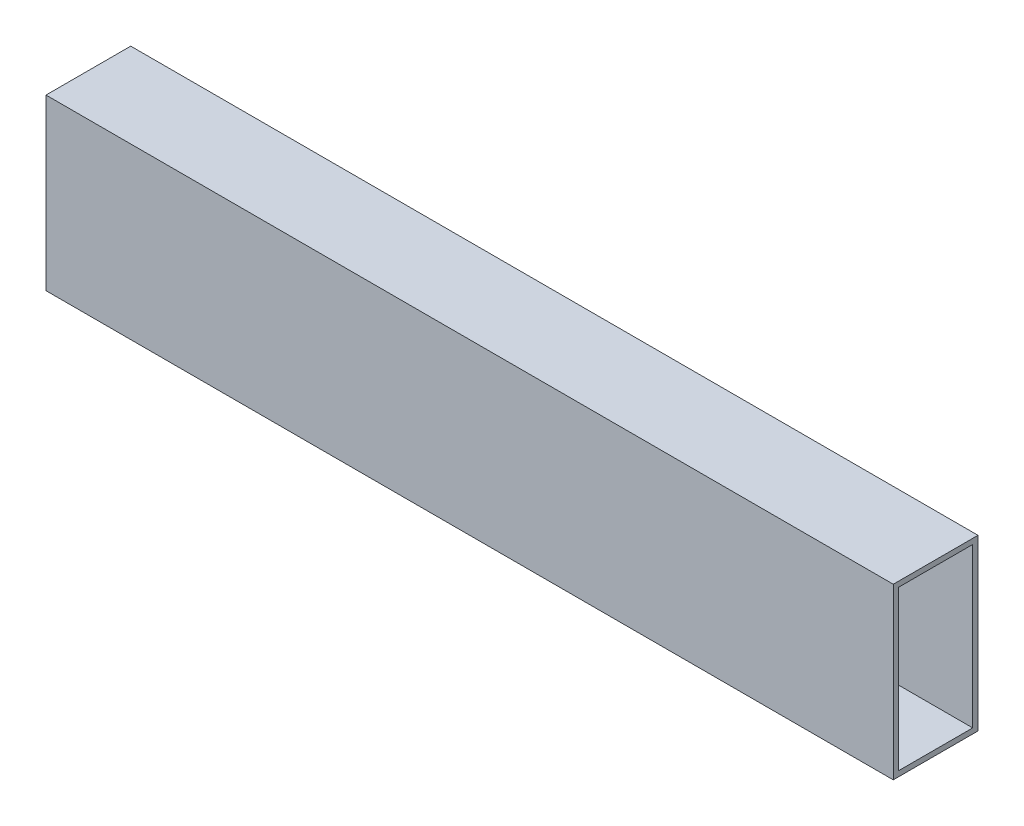
ISO-10303-21;
HEADER;
FILE_DESCRIPTION(('STEP AP214'),'2;1');
FILE_NAME('part.step','',(''),(''),'','','');
FILE_SCHEMA(('AUTOMOTIVE_DESIGN { 1 0 10303 214 1 1 1 1 }'));
ENDSEC;
DATA;
#1=APPLICATION_CONTEXT('core data for automotive mechanical design processes');
#2=APPLICATION_PROTOCOL_DEFINITION('international standard','automotive_design',2000,#1);
#3=PRODUCT_CONTEXT('',#1,'mechanical');
#4=PRODUCT('Part','Part','',(#3));
#5=PRODUCT_RELATED_PRODUCT_CATEGORY('part','',(#4));
#6=PRODUCT_DEFINITION_FORMATION('','',#4);
#7=PRODUCT_DEFINITION_CONTEXT('part definition',#1,'design');
#8=PRODUCT_DEFINITION('design','',#6,#7);
#9=PRODUCT_DEFINITION_SHAPE('','',#8);
#10=(LENGTH_UNIT() NAMED_UNIT(*) SI_UNIT(.MILLI.,.METRE.));
#11=(NAMED_UNIT(*) PLANE_ANGLE_UNIT() SI_UNIT($,.RADIAN.));
#12=(NAMED_UNIT(*) SI_UNIT($,.STERADIAN.) SOLID_ANGLE_UNIT());
#13=UNCERTAINTY_MEASURE_WITH_UNIT(LENGTH_MEASURE(1.E-05),#10,'distance_accuracy_value','');
#14=(GEOMETRIC_REPRESENTATION_CONTEXT(3) GLOBAL_UNCERTAINTY_ASSIGNED_CONTEXT((#13)) GLOBAL_UNIT_ASSIGNED_CONTEXT((#10,
#11,#12)) REPRESENTATION_CONTEXT('',''));
#15=CARTESIAN_POINT('',(0.,0.,0.));
#16=DIRECTION('',(0.,0.,1.));
#17=DIRECTION('',(1.,0.,0.));
#18=AXIS2_PLACEMENT_3D('',#15,#16,#17);
#19=CARTESIAN_POINT('',(127.,0.,0.));
#20=DIRECTION('',(-1.,0.,0.));
#21=DIRECTION('',(0.,0.,1.));
#22=AXIS2_PLACEMENT_3D('',#19,#20,#21);
#23=PLANE('',#22);
#24=DIRECTION('',(0.,1.,0.));
#25=VECTOR('',#24,1.);
#26=CARTESIAN_POINT('',(127.,-25.4,-14.6230032064473));
#27=LINE('',#26,#25);
#28=CARTESIAN_POINT('',(127.,-25.4,-14.6230032064473));
#29=VERTEX_POINT('',#28);
#30=CARTESIAN_POINT('',(127.,25.4,-14.6230032064473));
#31=VERTEX_POINT('',#30);
#32=EDGE_CURVE('E153',#29,#31,#27,.T.);
#33=ORIENTED_EDGE('',*,*,#32,.T.);
#34=DIRECTION('',(0.,0.,1.));
#35=VECTOR('',#34,1.);
#36=CARTESIAN_POINT('',(127.,25.4,10.7769967935527));
#37=LINE('',#36,#35);
#38=CARTESIAN_POINT('',(127.,25.4,10.7769967935527));
#39=VERTEX_POINT('',#38);
#40=EDGE_CURVE('E157',#31,#39,#37,.T.);
#41=ORIENTED_EDGE('',*,*,#40,.T.);
#42=DIRECTION('',(0.,-1.,0.));
#43=VECTOR('',#42,1.);
#44=CARTESIAN_POINT('',(127.,-25.4,10.7769967935527));
#45=LINE('',#44,#43);
#46=CARTESIAN_POINT('',(127.,-25.4,10.7769967935527));
#47=VERTEX_POINT('',#46);
#48=EDGE_CURVE('E161',#39,#47,#45,.T.);
#49=ORIENTED_EDGE('',*,*,#48,.T.);
#50=DIRECTION('',(0.,0.,-1.));
#51=VECTOR('',#50,1.);
#52=CARTESIAN_POINT('',(127.,-25.4,10.7769967935527));
#53=LINE('',#52,#51);
#54=EDGE_CURVE('E164',#47,#29,#53,.T.);
#55=ORIENTED_EDGE('',*,*,#54,.T.);
#56=EDGE_LOOP('',(#33,#41,#49,#55));
#57=FACE_BOUND('',#56,.T.);
#58=DIRECTION('',(0.,0.,-1.));
#59=VECTOR('',#58,1.);
#60=CARTESIAN_POINT('',(127.,-23.8125,9.18949679355275));
#61=LINE('',#60,#59);
#62=CARTESIAN_POINT('',(127.,-23.8125,9.18949679355275));
#63=VERTEX_POINT('',#62);
#64=CARTESIAN_POINT('',(127.,-23.8125,-13.0355032064473));
#65=VERTEX_POINT('',#64);
#66=EDGE_CURVE('E105',#63,#65,#61,.T.);
#67=ORIENTED_EDGE('',*,*,#66,.F.);
#68=DIRECTION('',(0.,-1.,0.));
#69=VECTOR('',#68,1.);
#70=CARTESIAN_POINT('',(127.,-23.8125,9.18949679355275));
#71=LINE('',#70,#69);
#72=CARTESIAN_POINT('',(127.,23.8125,9.18949679355275));
#73=VERTEX_POINT('',#72);
#74=EDGE_CURVE('E131',#73,#63,#71,.T.);
#75=ORIENTED_EDGE('',*,*,#74,.F.);
#76=DIRECTION('',(0.,0.,1.));
#77=VECTOR('',#76,1.);
#78=CARTESIAN_POINT('',(127.,23.8125,9.18949679355275));
#79=LINE('',#78,#77);
#80=CARTESIAN_POINT('',(127.,23.8125,-13.0355032064473));
#81=VERTEX_POINT('',#80);
#82=EDGE_CURVE('E127',#81,#73,#79,.T.);
#83=ORIENTED_EDGE('',*,*,#82,.F.);
#84=DIRECTION('',(0.,1.,0.));
#85=VECTOR('',#84,1.);
#86=CARTESIAN_POINT('',(127.,-23.8125,-13.0355032064473));
#87=LINE('',#86,#85);
#88=EDGE_CURVE('E114',#65,#81,#87,.T.);
#89=ORIENTED_EDGE('',*,*,#88,.F.);
#90=EDGE_LOOP('',(#67,#75,#83,#89));
#91=FACE_BOUND('',#90,.T.);
#92=ADVANCED_FACE('F39',(#57,#91),#23,.F.);
#93=CARTESIAN_POINT('',(-127.,0.,0.));
#94=DIRECTION('',(-1.,0.,0.));
#95=DIRECTION('',(0.,0.,1.));
#96=AXIS2_PLACEMENT_3D('',#93,#94,#95);
#97=PLANE('',#96);
#98=DIRECTION('',(0.,1.,0.));
#99=VECTOR('',#98,1.);
#100=CARTESIAN_POINT('',(-127.,-25.4,-14.6230032064473));
#101=LINE('',#100,#99);
#102=CARTESIAN_POINT('',(-127.,-25.4,-14.6230032064473));
#103=VERTEX_POINT('',#102);
#104=CARTESIAN_POINT('',(-127.,25.4,-14.6230032064473));
#105=VERTEX_POINT('',#104);
#106=EDGE_CURVE('E123',#103,#105,#101,.T.);
#107=ORIENTED_EDGE('',*,*,#106,.F.);
#108=DIRECTION('',(0.,0.,-1.));
#109=VECTOR('',#108,1.);
#110=CARTESIAN_POINT('',(-127.,-25.4,10.7769967935527));
#111=LINE('',#110,#109);
#112=CARTESIAN_POINT('',(-127.,-25.4,10.7769967935527));
#113=VERTEX_POINT('',#112);
#114=EDGE_CURVE('E158',#113,#103,#111,.T.);
#115=ORIENTED_EDGE('',*,*,#114,.F.);
#116=DIRECTION('',(0.,-1.,0.));
#117=VECTOR('',#116,1.);
#118=CARTESIAN_POINT('',(-127.,-25.4,10.7769967935527));
#119=LINE('',#118,#117);
#120=CARTESIAN_POINT('',(-127.,25.4,10.7769967935527));
#121=VERTEX_POINT('',#120);
#122=EDGE_CURVE('E174',#121,#113,#119,.T.);
#123=ORIENTED_EDGE('',*,*,#122,.F.);
#124=DIRECTION('',(0.,0.,1.));
#125=VECTOR('',#124,1.);
#126=CARTESIAN_POINT('',(-127.,25.4,10.7769967935527));
#127=LINE('',#126,#125);
#128=EDGE_CURVE('E171',#105,#121,#127,.T.);
#129=ORIENTED_EDGE('',*,*,#128,.F.);
#130=EDGE_LOOP('',(#107,#115,#123,#129));
#131=FACE_BOUND('',#130,.T.);
#132=DIRECTION('',(0.,-1.,0.));
#133=VECTOR('',#132,1.);
#134=CARTESIAN_POINT('',(-127.,-23.8125,9.18949679355275));
#135=LINE('',#134,#133);
#136=CARTESIAN_POINT('',(-127.,23.8125,9.18949679355275));
#137=VERTEX_POINT('',#136);
#138=CARTESIAN_POINT('',(-127.,-23.8125,9.18949679355275));
#139=VERTEX_POINT('',#138);
#140=EDGE_CURVE('E115',#137,#139,#135,.T.);
#141=ORIENTED_EDGE('',*,*,#140,.T.);
#142=DIRECTION('',(0.,0.,-1.));
#143=VECTOR('',#142,1.);
#144=CARTESIAN_POINT('',(-127.,-23.8125,9.18949679355275));
#145=LINE('',#144,#143);
#146=CARTESIAN_POINT('',(-127.,-23.8125,-13.0355032064473));
#147=VERTEX_POINT('',#146);
#148=EDGE_CURVE('E63',#139,#147,#145,.T.);
#149=ORIENTED_EDGE('',*,*,#148,.T.);
#150=DIRECTION('',(0.,1.,0.));
#151=VECTOR('',#150,1.);
#152=CARTESIAN_POINT('',(-127.,-23.8125,-13.0355032064473));
#153=LINE('',#152,#151);
#154=CARTESIAN_POINT('',(-127.,23.8125,-13.0355032064473));
#155=VERTEX_POINT('',#154);
#156=EDGE_CURVE('E121',#147,#155,#153,.T.);
#157=ORIENTED_EDGE('',*,*,#156,.T.);
#158=DIRECTION('',(0.,0.,1.));
#159=VECTOR('',#158,1.);
#160=CARTESIAN_POINT('',(-127.,23.8125,9.18949679355275));
#161=LINE('',#160,#159);
#162=EDGE_CURVE('E140',#155,#137,#161,.T.);
#163=ORIENTED_EDGE('',*,*,#162,.T.);
#164=EDGE_LOOP('',(#141,#149,#157,#163));
#165=FACE_BOUND('',#164,.T.);
#166=ADVANCED_FACE('F197',(#131,#165),#97,.T.);
#167=CARTESIAN_POINT('',(127.,-25.4,-14.6230032064473));
#168=DIRECTION('',(0.,0.,1.));
#169=DIRECTION('',(1.,0.,0.));
#170=AXIS2_PLACEMENT_3D('',#167,#168,#169);
#171=PLANE('',#170);
#172=ORIENTED_EDGE('',*,*,#106,.T.);
#173=DIRECTION('',(-1.,0.,0.));
#174=VECTOR('',#173,1.);
#175=CARTESIAN_POINT('',(127.,25.4,-14.6230032064473));
#176=LINE('',#175,#174);
#177=EDGE_CURVE('E11',#31,#105,#176,.T.);
#178=ORIENTED_EDGE('',*,*,#177,.F.);
#179=ORIENTED_EDGE('',*,*,#32,.F.);
#180=DIRECTION('',(-1.,0.,0.));
#181=VECTOR('',#180,1.);
#182=CARTESIAN_POINT('',(127.,-25.4,-14.6230032064473));
#183=LINE('',#182,#181);
#184=EDGE_CURVE('E167',#29,#103,#183,.T.);
#185=ORIENTED_EDGE('',*,*,#184,.T.);
#186=EDGE_LOOP('',(#172,#178,#179,#185));
#187=FACE_BOUND('',#186,.T.);
#188=ADVANCED_FACE('F41',(#187),#171,.F.);
#189=CARTESIAN_POINT('',(127.,25.4,10.7769967935527));
#190=DIRECTION('',(0.,-1.,0.));
#191=DIRECTION('',(0.,0.,-1.));
#192=AXIS2_PLACEMENT_3D('',#189,#190,#191);
#193=PLANE('',#192);
#194=ORIENTED_EDGE('',*,*,#128,.T.);
#195=DIRECTION('',(-1.,0.,0.));
#196=VECTOR('',#195,1.);
#197=CARTESIAN_POINT('',(127.,25.4,10.7769967935527));
#198=LINE('',#197,#196);
#199=EDGE_CURVE('E48',#39,#121,#198,.T.);
#200=ORIENTED_EDGE('',*,*,#199,.F.);
#201=ORIENTED_EDGE('',*,*,#40,.F.);
#202=ORIENTED_EDGE('',*,*,#177,.T.);
#203=EDGE_LOOP('',(#194,#200,#201,#202));
#204=FACE_BOUND('',#203,.T.);
#205=ADVANCED_FACE('F207',(#204),#193,.F.);
#206=CARTESIAN_POINT('',(127.,-25.4,10.7769967935527));
#207=DIRECTION('',(0.,0.,-1.));
#208=DIRECTION('',(-1.,0.,0.));
#209=AXIS2_PLACEMENT_3D('',#206,#207,#208);
#210=PLANE('',#209);
#211=ORIENTED_EDGE('',*,*,#122,.T.);
#212=DIRECTION('',(-1.,0.,0.));
#213=VECTOR('',#212,1.);
#214=CARTESIAN_POINT('',(127.,-25.4,10.7769967935527));
#215=LINE('',#214,#213);
#216=EDGE_CURVE('E182',#47,#113,#215,.T.);
#217=ORIENTED_EDGE('',*,*,#216,.F.);
#218=ORIENTED_EDGE('',*,*,#48,.F.);
#219=ORIENTED_EDGE('',*,*,#199,.T.);
#220=EDGE_LOOP('',(#211,#217,#218,#219));
#221=FACE_BOUND('',#220,.T.);
#222=ADVANCED_FACE('F191',(#221),#210,.F.);
#223=CARTESIAN_POINT('',(127.,-25.4,10.7769967935527));
#224=DIRECTION('',(0.,1.,0.));
#225=DIRECTION('',(0.,0.,1.));
#226=AXIS2_PLACEMENT_3D('',#223,#224,#225);
#227=PLANE('',#226);
#228=ORIENTED_EDGE('',*,*,#114,.T.);
#229=ORIENTED_EDGE('',*,*,#184,.F.);
#230=ORIENTED_EDGE('',*,*,#54,.F.);
#231=ORIENTED_EDGE('',*,*,#216,.T.);
#232=EDGE_LOOP('',(#228,#229,#230,#231));
#233=FACE_BOUND('',#232,.T.);
#234=ADVANCED_FACE('F201',(#233),#227,.F.);
#235=CARTESIAN_POINT('',(127.,-23.8125,9.18949679355275));
#236=DIRECTION('',(0.,1.,0.));
#237=DIRECTION('',(0.,0.,1.));
#238=AXIS2_PLACEMENT_3D('',#235,#236,#237);
#239=PLANE('',#238);
#240=ORIENTED_EDGE('',*,*,#148,.F.);
#241=DIRECTION('',(-1.,0.,0.));
#242=VECTOR('',#241,1.);
#243=CARTESIAN_POINT('',(127.,-23.8125,9.18949679355275));
#244=LINE('',#243,#242);
#245=EDGE_CURVE('E109',#63,#139,#244,.T.);
#246=ORIENTED_EDGE('',*,*,#245,.F.);
#247=ORIENTED_EDGE('',*,*,#66,.T.);
#248=DIRECTION('',(-1.,0.,0.));
#249=VECTOR('',#248,1.);
#250=CARTESIAN_POINT('',(127.,-23.8125,-13.0355032064473));
#251=LINE('',#250,#249);
#252=EDGE_CURVE('E108',#65,#147,#251,.T.);
#253=ORIENTED_EDGE('',*,*,#252,.T.);
#254=EDGE_LOOP('',(#240,#246,#247,#253));
#255=FACE_BOUND('',#254,.T.);
#256=ADVANCED_FACE('F107',(#255),#239,.T.);
#257=CARTESIAN_POINT('',(127.,-23.8125,-13.0355032064473));
#258=DIRECTION('',(0.,0.,1.));
#259=DIRECTION('',(0.,-1.,0.));
#260=AXIS2_PLACEMENT_3D('',#257,#258,#259);
#261=PLANE('',#260);
#262=ORIENTED_EDGE('',*,*,#156,.F.);
#263=ORIENTED_EDGE('',*,*,#252,.F.);
#264=ORIENTED_EDGE('',*,*,#88,.T.);
#265=DIRECTION('',(-1.,0.,0.));
#266=VECTOR('',#265,1.);
#267=CARTESIAN_POINT('',(127.,23.8125,-13.0355032064473));
#268=LINE('',#267,#266);
#269=EDGE_CURVE('E124',#81,#155,#268,.T.);
#270=ORIENTED_EDGE('',*,*,#269,.T.);
#271=EDGE_LOOP('',(#262,#263,#264,#270));
#272=FACE_BOUND('',#271,.T.);
#273=ADVANCED_FACE('F118',(#272),#261,.T.);
#274=CARTESIAN_POINT('',(127.,23.8125,9.18949679355275));
#275=DIRECTION('',(0.,-1.,0.));
#276=DIRECTION('',(0.,0.,-1.));
#277=AXIS2_PLACEMENT_3D('',#274,#275,#276);
#278=PLANE('',#277);
#279=ORIENTED_EDGE('',*,*,#162,.F.);
#280=ORIENTED_EDGE('',*,*,#269,.F.);
#281=ORIENTED_EDGE('',*,*,#82,.T.);
#282=DIRECTION('',(-1.,0.,0.));
#283=VECTOR('',#282,1.);
#284=CARTESIAN_POINT('',(127.,23.8125,9.18949679355275));
#285=LINE('',#284,#283);
#286=EDGE_CURVE('E55',#73,#137,#285,.T.);
#287=ORIENTED_EDGE('',*,*,#286,.T.);
#288=EDGE_LOOP('',(#279,#280,#281,#287));
#289=FACE_BOUND('',#288,.T.);
#290=ADVANCED_FACE('F230',(#289),#278,.T.);
#291=CARTESIAN_POINT('',(127.,-23.8125,9.18949679355275));
#292=DIRECTION('',(0.,0.,-1.));
#293=DIRECTION('',(-1.,0.,0.));
#294=AXIS2_PLACEMENT_3D('',#291,#292,#293);
#295=PLANE('',#294);
#296=ORIENTED_EDGE('',*,*,#140,.F.);
#297=ORIENTED_EDGE('',*,*,#286,.F.);
#298=ORIENTED_EDGE('',*,*,#74,.T.);
#299=ORIENTED_EDGE('',*,*,#245,.T.);
#300=EDGE_LOOP('',(#296,#297,#298,#299));
#301=FACE_BOUND('',#300,.T.);
#302=ADVANCED_FACE('F234',(#301),#295,.T.);
#303=CLOSED_SHELL('',(#92,#166,#188,#205,#222,#234,#256,#273,#290,#302));
#304=MANIFOLD_SOLID_BREP('B2',#303);
#305=ADVANCED_BREP_SHAPE_REPRESENTATION('',(#18,#304),#14);
#306=SHAPE_DEFINITION_REPRESENTATION(#9,#305);
ENDSEC;
END-ISO-10303-21;
